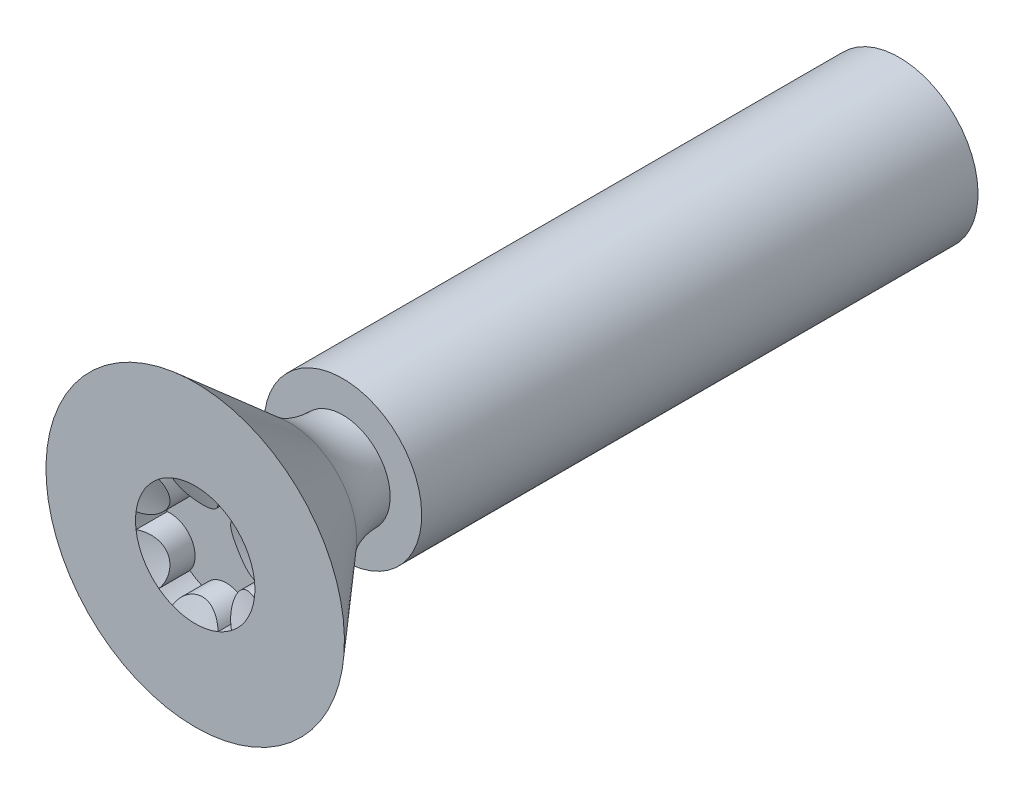
ISO-10303-21;
HEADER;
FILE_DESCRIPTION(('STEP AP214'),'2;1');
FILE_NAME('part.step','',(''),(''),'','','');
FILE_SCHEMA(('AUTOMOTIVE_DESIGN { 1 0 10303 214 1 1 1 1 }'));
ENDSEC;
DATA;
#1=APPLICATION_CONTEXT('core data for automotive mechanical design processes');
#2=APPLICATION_PROTOCOL_DEFINITION('international standard','automotive_design',2000,#1);
#3=PRODUCT_CONTEXT('',#1,'mechanical');
#4=PRODUCT('Part','Part','',(#3));
#5=PRODUCT_RELATED_PRODUCT_CATEGORY('part','',(#4));
#6=PRODUCT_DEFINITION_FORMATION('','',#4);
#7=PRODUCT_DEFINITION_CONTEXT('part definition',#1,'design');
#8=PRODUCT_DEFINITION('design','',#6,#7);
#9=PRODUCT_DEFINITION_SHAPE('','',#8);
#10=(LENGTH_UNIT() NAMED_UNIT(*) SI_UNIT(.MILLI.,.METRE.));
#11=(NAMED_UNIT(*) PLANE_ANGLE_UNIT() SI_UNIT($,.RADIAN.));
#12=(NAMED_UNIT(*) SI_UNIT($,.STERADIAN.) SOLID_ANGLE_UNIT());
#13=UNCERTAINTY_MEASURE_WITH_UNIT(LENGTH_MEASURE(1.E-05),#10,'distance_accuracy_value','');
#14=(GEOMETRIC_REPRESENTATION_CONTEXT(3) GLOBAL_UNCERTAINTY_ASSIGNED_CONTEXT((#13)) GLOBAL_UNIT_ASSIGNED_CONTEXT((#10,
#11,#12)) REPRESENTATION_CONTEXT('',''));
#15=CARTESIAN_POINT('',(0.,0.,0.));
#16=DIRECTION('',(0.,0.,1.));
#17=DIRECTION('',(1.,0.,0.));
#18=AXIS2_PLACEMENT_3D('',#15,#16,#17);
#19=CARTESIAN_POINT('',(0.,0.,-6.35));
#20=DIRECTION('',(0.,0.,1.));
#21=DIRECTION('',(0.,-1.,0.));
#22=AXIS2_PLACEMENT_3D('',#19,#20,#21);
#23=PLANE('',#22);
#24=CARTESIAN_POINT('',(0.,0.,-6.35));
#25=DIRECTION('',(0.,0.,1.));
#26=DIRECTION('',(0.,-1.,0.));
#27=AXIS2_PLACEMENT_3D('',#24,#25,#26);
#28=CIRCLE('',#27,1.4224);
#29=CARTESIAN_POINT('',(0.,-1.4224,-6.35));
#30=VERTEX_POINT('',#29);
#31=EDGE_CURVE('E51',#30,#30,#28,.T.);
#32=ORIENTED_EDGE('',*,*,#31,.F.);
#33=EDGE_LOOP('',(#32));
#34=FACE_BOUND('',#33,.T.);
#35=ADVANCED_FACE('F37',(#34),#23,.F.);
#36=CARTESIAN_POINT('',(0.,0.,6.35));
#37=DIRECTION('',(0.,0.,1.));
#38=DIRECTION('',(0.,-1.,0.));
#39=AXIS2_PLACEMENT_3D('',#36,#37,#38);
#40=CYLINDRICAL_SURFACE('',#39,1.4224);
#41=CARTESIAN_POINT('',(0.,0.,3.68638516960932));
#42=DIRECTION('',(0.,0.,1.));
#43=DIRECTION('',(0.,-1.,0.));
#44=AXIS2_PLACEMENT_3D('',#41,#42,#43);
#45=CIRCLE('',#44,1.4224);
#46=CARTESIAN_POINT('',(0.,-1.4224,3.68638516960932));
#47=VERTEX_POINT('',#46);
#48=EDGE_CURVE('E199',#47,#47,#45,.T.);
#49=ORIENTED_EDGE('',*,*,#48,.F.);
#50=EDGE_LOOP('',(#49));
#51=FACE_BOUND('',#50,.T.);
#52=ORIENTED_EDGE('',*,*,#31,.T.);
#53=EDGE_LOOP('',(#52));
#54=FACE_BOUND('',#53,.T.);
#55=ADVANCED_FACE('F204',(#51,#54),#40,.T.);
#56=CARTESIAN_POINT('',(0.,1.4224,3.68638516960932));
#57=DIRECTION('',(0.,0.,-1.));
#58=DIRECTION('',(0.,1.,0.));
#59=AXIS2_PLACEMENT_3D('',#56,#57,#58);
#60=PLANE('',#59);
#61=CARTESIAN_POINT('',(0.,0.,3.68638516960932));
#62=DIRECTION('',(0.,0.,1.));
#63=DIRECTION('',(0.,-1.,0.));
#64=AXIS2_PLACEMENT_3D('',#61,#62,#63);
#65=CIRCLE('',#64,0.853440000000003);
#66=CARTESIAN_POINT('',(0.,-0.853440000000004,3.68638516960932));
#67=VERTEX_POINT('',#66);
#68=EDGE_CURVE('E196',#67,#67,#65,.T.);
#69=ORIENTED_EDGE('',*,*,#68,.F.);
#70=EDGE_LOOP('',(#69));
#71=FACE_BOUND('',#70,.T.);
#72=ORIENTED_EDGE('',*,*,#48,.T.);
#73=EDGE_LOOP('',(#72));
#74=FACE_BOUND('',#73,.T.);
#75=ADVANCED_FACE('F210',(#71,#74),#60,.F.);
#76=CARTESIAN_POINT('',(0.,0.,3.68638516960932));
#77=DIRECTION('',(0.,0.,1.));
#78=DIRECTION('',(0.,-1.,0.));
#79=AXIS2_PLACEMENT_3D('',#76,#77,#78);
#80=TOROIDAL_SURFACE('',#79,2.31948922406243,1.46604922406243);
#81=CARTESIAN_POINT('',(0.,0.,4.6482));
#82=DIRECTION('',(0.,0.,1.));
#83=DIRECTION('',(0.,-1.,0.));
#84=AXIS2_PLACEMENT_3D('',#81,#82,#83);
#85=CIRCLE('',#84,1.21304782958435);
#86=CARTESIAN_POINT('',(0.,-1.21304782958435,4.6482));
#87=VERTEX_POINT('',#86);
#88=EDGE_CURVE('E193',#87,#87,#85,.T.);
#89=ORIENTED_EDGE('',*,*,#88,.F.);
#90=EDGE_LOOP('',(#89));
#91=FACE_BOUND('',#90,.T.);
#92=ORIENTED_EDGE('',*,*,#68,.T.);
#93=EDGE_LOOP('',(#92));
#94=FACE_BOUND('',#93,.T.);
#95=ADVANCED_FACE('F215',(#91,#94),#80,.F.);
#96=CARTESIAN_POINT('',(0.,0.,4.6482));
#97=DIRECTION('',(0.,0.,1.));
#98=DIRECTION('',(0.,-1.,0.));
#99=AXIS2_PLACEMENT_3D('',#96,#97,#98);
#100=CONICAL_SURFACE('',#99,1.21304782958435,0.715584993317673);
#101=CARTESIAN_POINT('',(0.,0.,6.35));
#102=DIRECTION('',(0.,0.,1.));
#103=DIRECTION('',(0.,-1.,0.));
#104=AXIS2_PLACEMENT_3D('',#101,#102,#103);
#105=CIRCLE('',#104,2.6924);
#106=CARTESIAN_POINT('',(0.,-2.6924,6.35));
#107=VERTEX_POINT('',#106);
#108=EDGE_CURVE('E188',#107,#107,#105,.T.);
#109=ORIENTED_EDGE('',*,*,#108,.F.);
#110=EDGE_LOOP('',(#109));
#111=FACE_BOUND('',#110,.T.);
#112=ORIENTED_EDGE('',*,*,#88,.T.);
#113=EDGE_LOOP('',(#112));
#114=FACE_BOUND('',#113,.T.);
#115=ADVANCED_FACE('F222',(#111,#114),#100,.T.);
#116=CARTESIAN_POINT('',(0.,2.6924,6.35));
#117=DIRECTION('',(0.,0.,-1.));
#118=DIRECTION('',(0.,1.,0.));
#119=AXIS2_PLACEMENT_3D('',#116,#117,#118);
#120=PLANE('',#119);
#121=CARTESIAN_POINT('',(0.,0.,6.35));
#122=DIRECTION('',(0.,0.,1.));
#123=DIRECTION('',(1.,0.,0.));
#124=AXIS2_PLACEMENT_3D('',#121,#122,#123);
#125=CIRCLE('',#124,1.07696);
#126=CARTESIAN_POINT('',(0.655611708585233,0.854409813360048,6.35));
#127=VERTEX_POINT('',#126);
#128=CARTESIAN_POINT('',(0.412134749319907,0.994981301333356,6.35));
#129=VERTEX_POINT('',#128);
#130=EDGE_CURVE('E147',#127,#129,#125,.T.);
#131=ORIENTED_EDGE('',*,*,#130,.F.);
#132=CARTESIAN_POINT('',(0.,0.,6.35));
#133=DIRECTION('',(0.,0.,1.));
#134=DIRECTION('',(1.,0.,0.));
#135=AXIS2_PLACEMENT_3D('',#132,#133,#134);
#136=CIRCLE('',#135,1.07696);
#137=CARTESIAN_POINT('',(1.06774645790514,0.140571487973304,6.35));
#138=VERTEX_POINT('',#137);
#139=EDGE_CURVE('E130',#138,#127,#136,.T.);
#140=ORIENTED_EDGE('',*,*,#139,.F.);
#141=CARTESIAN_POINT('',(0.,0.,6.35));
#142=DIRECTION('',(0.,0.,1.));
#143=DIRECTION('',(0.499999999999998,-0.86602540378444,0.));
#144=AXIS2_PLACEMENT_3D('',#141,#142,#143);
#145=CIRCLE('',#144,1.07696);
#146=CARTESIAN_POINT('',(1.06774645790514,-0.140571487973311,6.35));
#147=VERTEX_POINT('',#146);
#148=EDGE_CURVE('E144',#147,#138,#145,.T.);
#149=ORIENTED_EDGE('',*,*,#148,.F.);
#150=CARTESIAN_POINT('',(0.655611708585228,-0.854409813360052,6.35));
#151=VERTEX_POINT('',#150);
#152=EDGE_CURVE('E152',#151,#147,#136,.T.);
#153=ORIENTED_EDGE('',*,*,#152,.F.);
#154=CARTESIAN_POINT('',(0.,0.,6.35));
#155=DIRECTION('',(0.,0.,1.));
#156=DIRECTION('',(-0.500000000000004,-0.866025403784436,0.));
#157=AXIS2_PLACEMENT_3D('',#154,#155,#156);
#158=CIRCLE('',#157,1.07696);
#159=CARTESIAN_POINT('',(0.412134749319908,-0.994981301333355,6.35));
#160=VERTEX_POINT('',#159);
#161=EDGE_CURVE('E314',#160,#151,#158,.T.);
#162=ORIENTED_EDGE('',*,*,#161,.F.);
#163=CARTESIAN_POINT('',(-0.412134749319907,-0.994981301333356,6.35));
#164=VERTEX_POINT('',#163);
#165=EDGE_CURVE('E315',#164,#160,#136,.T.);
#166=ORIENTED_EDGE('',*,*,#165,.F.);
#167=CARTESIAN_POINT('',(0.,0.,6.35));
#168=DIRECTION('',(0.,0.,1.));
#169=DIRECTION('',(-1.,0.,0.));
#170=AXIS2_PLACEMENT_3D('',#167,#168,#169);
#171=CIRCLE('',#170,1.07696);
#172=CARTESIAN_POINT('',(-0.655611708585239,-0.854409813360043,6.35));
#173=VERTEX_POINT('',#172);
#174=EDGE_CURVE('E349',#173,#164,#171,.T.);
#175=ORIENTED_EDGE('',*,*,#174,.F.);
#176=CARTESIAN_POINT('',(-1.06774645790514,-0.140571487973297,6.35));
#177=VERTEX_POINT('',#176);
#178=EDGE_CURVE('E316',#177,#173,#136,.T.);
#179=ORIENTED_EDGE('',*,*,#178,.F.);
#180=CARTESIAN_POINT('',(0.,0.,6.35));
#181=DIRECTION('',(0.,0.,1.));
#182=DIRECTION('',(-0.499999999999992,0.866025403784443,0.));
#183=AXIS2_PLACEMENT_3D('',#180,#181,#182);
#184=CIRCLE('',#183,1.07696);
#185=CARTESIAN_POINT('',(-1.06774645790514,0.140571487973318,6.35));
#186=VERTEX_POINT('',#185);
#187=EDGE_CURVE('E332',#186,#177,#184,.T.);
#188=ORIENTED_EDGE('',*,*,#187,.F.);
#189=CARTESIAN_POINT('',(-0.655611708585222,0.854409813360056,6.35));
#190=VERTEX_POINT('',#189);
#191=EDGE_CURVE('E319',#190,#186,#136,.T.);
#192=ORIENTED_EDGE('',*,*,#191,.F.);
#193=CARTESIAN_POINT('',(0.,0.,6.35));
#194=DIRECTION('',(0.,0.,1.));
#195=DIRECTION('',(1.,0.,0.));
#196=AXIS2_PLACEMENT_3D('',#193,#194,#195);
#197=CIRCLE('',#196,1.07696);
#198=CARTESIAN_POINT('',(-0.412134749319908,0.994981301333355,6.35));
#199=VERTEX_POINT('',#198);
#200=EDGE_CURVE('E178',#199,#190,#197,.T.);
#201=ORIENTED_EDGE('',*,*,#200,.F.);
#202=EDGE_CURVE('E150',#129,#199,#136,.T.);
#203=ORIENTED_EDGE('',*,*,#202,.F.);
#204=EDGE_LOOP('',(#131,#140,#149,#153,#162,#166,#175,#179,#188,#192,#201,#203));
#205=FACE_BOUND('',#204,.T.);
#206=ORIENTED_EDGE('',*,*,#108,.T.);
#207=EDGE_LOOP('',(#206));
#208=FACE_BOUND('',#207,.T.);
#209=ADVANCED_FACE('F140',(#205,#208),#120,.F.);
#210=CARTESIAN_POINT('',(0.,0.,5.788406));
#211=DIRECTION('',(0.,0.,1.));
#212=DIRECTION('',(1.,0.,0.));
#213=AXIS2_PLACEMENT_3D('',#210,#211,#212);
#214=CYLINDRICAL_SURFACE('',#213,1.07696);
#215=ORIENTED_EDGE('',*,*,#200,.T.);
#216=DIRECTION('',(0.,0.,1.));
#217=VECTOR('',#216,1.);
#218=CARTESIAN_POINT('',(-0.655611708585222,0.854409813360056,5.788406));
#219=LINE('',#218,#217);
#220=CARTESIAN_POINT('',(-0.655611708585222,0.854409813360056,5.788406));
#221=VERTEX_POINT('',#220);
#222=EDGE_CURVE('E343',#221,#190,#219,.T.);
#223=ORIENTED_EDGE('',*,*,#222,.F.);
#224=CARTESIAN_POINT('',(0.,0.,5.788406));
#225=DIRECTION('',(0.,0.,1.));
#226=DIRECTION('',(1.,0.,0.));
#227=AXIS2_PLACEMENT_3D('',#224,#225,#226);
#228=CIRCLE('',#227,1.07696);
#229=CARTESIAN_POINT('',(-0.412134749319908,0.994981301333355,5.788406));
#230=VERTEX_POINT('',#229);
#231=EDGE_CURVE('E181',#230,#221,#228,.T.);
#232=ORIENTED_EDGE('',*,*,#231,.F.);
#233=DIRECTION('',(0.,0.,1.));
#234=VECTOR('',#233,1.);
#235=CARTESIAN_POINT('',(-0.412134749319908,0.994981301333355,5.788406));
#236=LINE('',#235,#234);
#237=EDGE_CURVE('E58',#230,#199,#236,.T.);
#238=ORIENTED_EDGE('',*,*,#237,.T.);
#239=EDGE_LOOP('',(#215,#223,#232,#238));
#240=FACE_BOUND('',#239,.T.);
#241=ADVANCED_FACE('F229',(#240),#214,.F.);
#242=CARTESIAN_POINT('',(0.,1.1656931040269,5.788406));
#243=DIRECTION('',(0.,0.,1.));
#244=DIRECTION('',(1.,0.,0.));
#245=AXIS2_PLACEMENT_3D('',#242,#243,#244);
#246=CYLINDRICAL_SURFACE('',#245,0.446091438133329);
#247=DIRECTION('',(0.,0.,1.));
#248=VECTOR('',#247,1.);
#249=CARTESIAN_POINT('',(0.412134749319907,0.994981301333355,5.788406));
#250=LINE('',#249,#248);
#251=CARTESIAN_POINT('',(0.412134749319907,0.994981301333355,5.788406));
#252=VERTEX_POINT('',#251);
#253=EDGE_CURVE('E183',#252,#129,#250,.T.);
#254=ORIENTED_EDGE('',*,*,#253,.T.);
#255=CARTESIAN_POINT('',(0.412217535189932,0.995181301333363,6.35007878379122));
#256=CARTESIAN_POINT('',(0.402218532584292,0.970978856009884,6.34056377677122));
#257=CARTESIAN_POINT('',(0.390069787174501,0.947669824303697,6.33101891366794));
#258=CARTESIAN_POINT('',(0.361780712977006,0.903392429802186,6.31220411475033));
#259=CARTESIAN_POINT('',(0.345629774957911,0.882430506814702,6.30293498421686));
#260=CARTESIAN_POINT('',(0.309679984041634,0.843514203319636,6.28505045217848));
#261=CARTESIAN_POINT('',(0.289876786592517,0.82556345383982,6.27643584668143));
#262=CARTESIAN_POINT('',(0.247080771537108,0.793315302332872,6.26039120388156));
#263=CARTESIAN_POINT('',(0.224090675265836,0.779014812594221,6.25296016742611));
#264=CARTESIAN_POINT('',(0.176713064753171,0.755283841482144,6.24025566684374));
#265=CARTESIAN_POINT('',(0.152456468355724,0.745642319957259,6.23489154992137));
#266=CARTESIAN_POINT('',(0.102273448420043,0.730698298567651,6.22642957349096));
#267=CARTESIAN_POINT('',(0.0763492624458178,0.725390110068896,6.22332874339494));
#268=CARTESIAN_POINT('',(0.0270471068895947,0.719818940453361,6.22006478463054));
#269=CARTESIAN_POINT('',(0.00375046947984284,0.71901346298047,6.2195859263302));
#270=CARTESIAN_POINT('',(-0.0426261801452408,0.721037250446202,6.22077785922149));
#271=CARTESIAN_POINT('',(-0.0657062300058927,0.723865871493425,6.22244826960471));
#272=CARTESIAN_POINT('',(-0.109487556319788,0.732706386386486,6.22755874354336));
#273=CARTESIAN_POINT('',(-0.130246890731964,0.738505190424075,6.23087995243548));
#274=CARTESIAN_POINT('',(-0.170477358946198,0.752907678496629,6.23891229574263));
#275=CARTESIAN_POINT('',(-0.189948239915114,0.761511911088823,6.24362370197164));
#276=CARTESIAN_POINT('',(-0.228759760915408,0.782043850090003,6.25452461342052));
#277=CARTESIAN_POINT('',(-0.247962722776532,0.794183940675942,6.26080279790926));
#278=CARTESIAN_POINT('',(-0.284136023529871,0.821058978826113,6.27421274588709));
#279=CARTESIAN_POINT('',(-0.301104417812656,0.835796160747644,6.28134524266095));
#280=CARTESIAN_POINT('',(-0.334388855623221,0.869374807430502,6.29702366364388));
#281=CARTESIAN_POINT('',(-0.350391677575767,0.88849537385316,6.30563706078043));
#282=CARTESIAN_POINT('',(-0.378924549806628,0.928995777520554,6.32318513890219));
#283=CARTESIAN_POINT('',(-0.391460272419411,0.950371844535248,6.33211926776797));
#284=CARTESIAN_POINT('',(-0.405706120214104,0.980035972287522,6.34407927085055));
#285=CARTESIAN_POINT('',(-0.409068533600499,0.98756633153689,6.34708004824173));
#286=CARTESIAN_POINT('',(-0.412217535189934,0.995181301333363,6.35007878379122));
#287=B_SPLINE_CURVE_WITH_KNOTS('',3,(#255,#256,#257,#258,#259,#260,#261,#262,#263,#264,#265,
#266,#267,#268,#269,#270,#271,#272,#273,#274,#275,#276,#277,#278,#279,#280,#281,#282,#283,#284,
#285,#286),.UNSPECIFIED.,.F.,.F.,(4,2,2,2,2,2,2,2,2,2,2,2,2,2,2,4),(0.,0.0835011768916914,
0.167226116630064,0.251051301543926,0.33480534297495,0.414291234869104,0.493672612159344,
0.563242414916322,0.632799892960467,0.697949380928841,0.763111615497498,0.8335396810455,
0.904028636484711,0.982834929381849,1.06151151843471,1.08782618491492),.UNSPECIFIED.);
#288=EDGE_CURVE('E135',#129,#199,#287,.T.);
#289=ORIENTED_EDGE('',*,*,#288,.T.);
#290=ORIENTED_EDGE('',*,*,#237,.F.);
#291=CARTESIAN_POINT('',(0.,1.1656931040269,5.788406));
#292=DIRECTION('',(0.,0.,-1.));
#293=DIRECTION('',(1.,0.,0.));
#294=AXIS2_PLACEMENT_3D('',#291,#292,#293);
#295=CIRCLE('',#294,0.446091438133329);
#296=EDGE_CURVE('E177',#252,#230,#295,.T.);
#297=ORIENTED_EDGE('',*,*,#296,.F.);
#298=EDGE_LOOP('',(#254,#289,#290,#297));
#299=FACE_BOUND('',#298,.T.);
#300=ADVANCED_FACE('F234',(#299),#246,.T.);
#301=CARTESIAN_POINT('',(0.,0.,5.788406));
#302=DIRECTION('',(0.,0.,1.));
#303=DIRECTION('',(1.,0.,0.));
#304=AXIS2_PLACEMENT_3D('',#301,#302,#303);
#305=CYLINDRICAL_SURFACE('',#304,1.07696);
#306=ORIENTED_EDGE('',*,*,#130,.T.);
#307=ORIENTED_EDGE('',*,*,#253,.F.);
#308=CARTESIAN_POINT('',(0.,0.,5.788406));
#309=DIRECTION('',(0.,0.,1.));
#310=DIRECTION('',(1.,0.,0.));
#311=AXIS2_PLACEMENT_3D('',#308,#309,#310);
#312=CIRCLE('',#311,1.07696);
#313=CARTESIAN_POINT('',(0.655611708585233,0.854409813360048,5.788406));
#314=VERTEX_POINT('',#313);
#315=EDGE_CURVE('E174',#314,#252,#312,.T.);
#316=ORIENTED_EDGE('',*,*,#315,.F.);
#317=DIRECTION('',(0.,0.,1.));
#318=VECTOR('',#317,1.);
#319=CARTESIAN_POINT('',(0.655611708585233,0.854409813360048,5.788406));
#320=LINE('',#319,#318);
#321=EDGE_CURVE('E160',#314,#127,#320,.T.);
#322=ORIENTED_EDGE('',*,*,#321,.T.);
#323=EDGE_LOOP('',(#306,#307,#316,#322));
#324=FACE_BOUND('',#323,.T.);
#325=ADVANCED_FACE('F230',(#324),#305,.F.);
#326=CARTESIAN_POINT('',(0.,0.,5.788406));
#327=DIRECTION('',(0.,0.,1.));
#328=DIRECTION('',(1.,0.,0.));
#329=AXIS2_PLACEMENT_3D('',#326,#327,#328);
#330=PLANE('',#329);
#331=CARTESIAN_POINT('',(1.00951984110363,0.582846552013447,5.788406));
#332=DIRECTION('',(0.,0.,-1.));
#333=DIRECTION('',(0.499999999999998,-0.86602540378444,0.));
#334=AXIS2_PLACEMENT_3D('',#331,#332,#333);
#335=CIRCLE('',#334,0.446091438133329);
#336=CARTESIAN_POINT('',(1.06774645790514,0.140571487973304,5.788406));
#337=VERTEX_POINT('',#336);
#338=EDGE_CURVE('E157',#337,#314,#335,.T.);
#339=ORIENTED_EDGE('',*,*,#338,.T.);
#340=ORIENTED_EDGE('',*,*,#315,.T.);
#341=ORIENTED_EDGE('',*,*,#296,.T.);
#342=ORIENTED_EDGE('',*,*,#231,.T.);
#343=CARTESIAN_POINT('',(-1.00951984110362,0.58284655201346,5.788406));
#344=DIRECTION('',(0.,0.,-1.));
#345=DIRECTION('',(0.50000000000001,0.866025403784433,0.));
#346=AXIS2_PLACEMENT_3D('',#343,#344,#345);
#347=CIRCLE('',#346,0.446091438133329);
#348=CARTESIAN_POINT('',(-1.06774645790514,0.140571487973318,5.788406));
#349=VERTEX_POINT('',#348);
#350=EDGE_CURVE('E246',#221,#349,#347,.T.);
#351=ORIENTED_EDGE('',*,*,#350,.T.);
#352=CARTESIAN_POINT('',(0.,0.,5.788406));
#353=DIRECTION('',(0.,0.,1.));
#354=DIRECTION('',(-0.499999999999992,0.866025403784443,0.));
#355=AXIS2_PLACEMENT_3D('',#352,#353,#354);
#356=CIRCLE('',#355,1.07696);
#357=CARTESIAN_POINT('',(-1.06774645790514,-0.140571487973297,5.788406));
#358=VERTEX_POINT('',#357);
#359=EDGE_CURVE('E337',#349,#358,#356,.T.);
#360=ORIENTED_EDGE('',*,*,#359,.T.);
#361=CARTESIAN_POINT('',(-1.00951984110363,-0.58284655201344,5.788406));
#362=DIRECTION('',(0.,0.,-1.));
#363=DIRECTION('',(-0.499999999999992,0.866025403784443,0.));
#364=AXIS2_PLACEMENT_3D('',#361,#362,#363);
#365=CIRCLE('',#364,0.446091438133329);
#366=CARTESIAN_POINT('',(-0.655611708585239,-0.854409813360043,5.788406));
#367=VERTEX_POINT('',#366);
#368=EDGE_CURVE('E341',#358,#367,#365,.T.);
#369=ORIENTED_EDGE('',*,*,#368,.T.);
#370=CARTESIAN_POINT('',(0.,0.,5.788406));
#371=DIRECTION('',(0.,0.,1.));
#372=DIRECTION('',(-1.,0.,0.));
#373=AXIS2_PLACEMENT_3D('',#370,#371,#372);
#374=CIRCLE('',#373,1.07696);
#375=CARTESIAN_POINT('',(-0.412134749319907,-0.994981301333355,5.788406));
#376=VERTEX_POINT('',#375);
#377=EDGE_CURVE('E352',#367,#376,#374,.T.);
#378=ORIENTED_EDGE('',*,*,#377,.T.);
#379=CARTESIAN_POINT('',(0.,-1.1656931040269,5.788406));
#380=DIRECTION('',(0.,0.,-1.));
#381=DIRECTION('',(-1.,0.,0.));
#382=AXIS2_PLACEMENT_3D('',#379,#380,#381);
#383=CIRCLE('',#382,0.446091438133329);
#384=CARTESIAN_POINT('',(0.412134749319908,-0.994981301333355,5.788406));
#385=VERTEX_POINT('',#384);
#386=EDGE_CURVE('E355',#376,#385,#383,.T.);
#387=ORIENTED_EDGE('',*,*,#386,.T.);
#388=CARTESIAN_POINT('',(0.,0.,5.788406));
#389=DIRECTION('',(0.,0.,1.));
#390=DIRECTION('',(-0.500000000000004,-0.866025403784436,0.));
#391=AXIS2_PLACEMENT_3D('',#388,#389,#390);
#392=CIRCLE('',#391,1.07696);
#393=CARTESIAN_POINT('',(0.655611708585228,-0.854409813360052,5.788406));
#394=VERTEX_POINT('',#393);
#395=EDGE_CURVE('E366',#385,#394,#392,.T.);
#396=ORIENTED_EDGE('',*,*,#395,.T.);
#397=CARTESIAN_POINT('',(1.00951984110363,-0.582846552013453,5.788406));
#398=DIRECTION('',(0.,0.,-1.));
#399=DIRECTION('',(-0.500000000000004,-0.866025403784436,0.));
#400=AXIS2_PLACEMENT_3D('',#397,#398,#399);
#401=CIRCLE('',#400,0.446091438133329);
#402=CARTESIAN_POINT('',(1.06774645790514,-0.140571487973311,5.788406));
#403=VERTEX_POINT('',#402);
#404=EDGE_CURVE('E307',#394,#403,#401,.T.);
#405=ORIENTED_EDGE('',*,*,#404,.T.);
#406=CARTESIAN_POINT('',(0.,0.,5.788406));
#407=DIRECTION('',(0.,0.,1.));
#408=DIRECTION('',(0.499999999999998,-0.86602540378444,0.));
#409=AXIS2_PLACEMENT_3D('',#406,#407,#408);
#410=CIRCLE('',#409,1.07696);
#411=EDGE_CURVE('E166',#403,#337,#410,.T.);
#412=ORIENTED_EDGE('',*,*,#411,.T.);
#413=EDGE_LOOP('',(#339,#340,#341,#342,#351,#360,#369,#378,#387,#396,#405,#412));
#414=FACE_BOUND('',#413,.T.);
#415=ADVANCED_FACE('F233',(#414),#330,.T.);
#416=CARTESIAN_POINT('',(1.00951984110363,0.582846552013447,5.788406));
#417=DIRECTION('',(0.,0.,1.));
#418=DIRECTION('',(1.,0.,0.));
#419=AXIS2_PLACEMENT_3D('',#416,#417,#418);
#420=CYLINDRICAL_SURFACE('',#419,0.446091438133329);
#421=DIRECTION('',(0.,0.,1.));
#422=VECTOR('',#421,1.);
#423=CARTESIAN_POINT('',(1.06774645790514,0.140571487973304,5.788406));
#424=LINE('',#423,#422);
#425=EDGE_CURVE('E154',#337,#138,#424,.T.);
#426=ORIENTED_EDGE('',*,*,#425,.T.);
#427=CARTESIAN_POINT('',(1.06794645790514,0.140597864480073,6.35007342436951));
#428=CARTESIAN_POINT('',(1.0419870198108,0.137156903808665,6.34055845784469));
#429=CARTESIAN_POINT('',(1.01572649723712,0.136024370427879,6.33101365798389));
#430=CARTESIAN_POINT('',(0.963236856382313,0.138386419626026,6.31219904050315));
#431=CARTESIAN_POINT('',(0.937008010910264,0.141893411870822,6.30293002845079));
#432=CARTESIAN_POINT('',(0.885331089012054,0.153570315168539,6.2850458053512));
#433=CARTESIAN_POINT('',(0.859883985138948,0.161745804871025,6.2764313904983));
#434=CARTESIAN_POINT('',(0.810558986388017,0.182685695571367,6.26038722372097));
#435=CARTESIAN_POINT('',(0.786679777731734,0.195446195105916,6.25295647233255));
#436=CARTESIAN_POINT('',(0.742440426279593,0.22461220479501,6.24025266671022));
#437=CARTESIAN_POINT('',(0.721962958089376,0.240798798794242,6.23488894526767));
#438=CARTESIAN_POINT('',(0.683930895704958,0.276787459278119,6.22642781850148));
#439=CARTESIAN_POINT('',(0.666372493733786,0.296584743926222,6.22332744255509));
#440=CARTESIAN_POINT('',(0.636898066295452,0.33649656190161,6.22006433751378));
#441=CARTESIAN_POINT('',(0.624552878991043,0.356269428534179,6.21958587440746));
#442=CARTESIAN_POINT('',(0.603118577567221,0.397444772762326,6.22077853322926));
#443=CARTESIAN_POINT('',(0.594028887374358,0.418846961229223,6.22244927460643));
#444=CARTESIAN_POINT('',(0.579795498616561,0.461183032826544,6.22756032802164));
#445=CARTESIAN_POINT('',(0.574438272675969,0.482060669070351,6.23088181302144));
#446=CARTESIAN_POINT('',(0.566797021813467,0.52410268317885,6.23891465381128));
#447=CARTESIAN_POINT('',(0.564513598463478,0.54526711635398,6.24362628144533));
#448=CARTESIAN_POINT('',(0.562890111667022,0.589145052048377,6.25452764540709));
#449=CARTESIAN_POINT('',(0.56380284668153,0.611845506362739,6.26080606696333));
#450=CARTESIAN_POINT('',(0.568991878426509,0.656610244451042,6.27421644490775));
#451=CARTESIAN_POINT('',(0.573271082083871,0.67867396132832,6.2813491344369));
#452=CARTESIAN_POINT('',(0.585710169356141,0.724288446915928,6.29702790521994));
#453=CARTESIAN_POINT('',(0.594268368370634,0.74770750002312,6.30564145312157));
#454=CARTESIAN_POINT('',(0.615077746169878,0.792667622895215,6.32318978825504));
#455=CARTESIAN_POINT('',(0.627322825665854,0.814211719140461,6.33212402362899));
#456=CARTESIAN_POINT('',(0.645894926147466,0.841386822500592,6.34408683379995));
#457=CARTESIAN_POINT('',(0.650739946248591,0.84806971006797,6.3470903299764));
#458=CARTESIAN_POINT('',(0.655765263796742,0.854609813346334,6.35009177478416));
#459=B_SPLINE_CURVE_WITH_KNOTS('',3,(#427,#428,#429,#430,#431,#432,#433,#434,#435,#436,#437,
#438,#439,#440,#441,#442,#443,#444,#445,#446,#447,#448,#449,#450,#451,#452,#453,#454,#455,#456,
#457,#458),.UNSPECIFIED.,.F.,.F.,(4,2,2,2,2,2,2,2,2,2,2,2,2,2,2,4),(0.,0.0835008294128591,
0.167225456561838,0.25105034095401,0.334804065582383,0.414289219499643,0.493669861304818,
0.563238866404968,0.632795554897446,0.697945136265738,0.763107466163767,0.833536236880948,
0.904025889288688,0.982832800048652,1.06151004848508,1.0878484953377),.UNSPECIFIED.);
#460=EDGE_CURVE('E127',#138,#127,#459,.T.);
#461=ORIENTED_EDGE('',*,*,#460,.T.);
#462=ORIENTED_EDGE('',*,*,#321,.F.);
#463=ORIENTED_EDGE('',*,*,#338,.F.);
#464=EDGE_LOOP('',(#426,#461,#462,#463));
#465=FACE_BOUND('',#464,.T.);
#466=ADVANCED_FACE('F155',(#465),#420,.T.);
#467=CARTESIAN_POINT('',(0.,0.,5.788406));
#468=DIRECTION('',(0.,0.,1.));
#469=DIRECTION('',(1.,0.,0.));
#470=AXIS2_PLACEMENT_3D('',#467,#468,#469);
#471=CYLINDRICAL_SURFACE('',#470,1.07696);
#472=ORIENTED_EDGE('',*,*,#148,.T.);
#473=ORIENTED_EDGE('',*,*,#425,.F.);
#474=ORIENTED_EDGE('',*,*,#411,.F.);
#475=DIRECTION('',(0.,0.,1.));
#476=VECTOR('',#475,1.);
#477=CARTESIAN_POINT('',(1.06774645790514,-0.140571487973311,5.788406));
#478=LINE('',#477,#476);
#479=EDGE_CURVE('E165',#403,#147,#478,.T.);
#480=ORIENTED_EDGE('',*,*,#479,.T.);
#481=EDGE_LOOP('',(#472,#473,#474,#480));
#482=FACE_BOUND('',#481,.T.);
#483=ADVANCED_FACE('F163',(#482),#471,.F.);
#484=CARTESIAN_POINT('',(1.00951984110363,-0.582846552013453,5.788406));
#485=DIRECTION('',(0.,0.,1.));
#486=DIRECTION('',(0.,-1.,0.));
#487=AXIS2_PLACEMENT_3D('',#484,#485,#486);
#488=CYLINDRICAL_SURFACE('',#487,0.446091438133329);
#489=DIRECTION('',(0.,0.,1.));
#490=VECTOR('',#489,1.);
#491=CARTESIAN_POINT('',(0.655611708585228,-0.854409813360052,5.788406));
#492=LINE('',#491,#490);
#493=EDGE_CURVE('E169',#394,#151,#492,.T.);
#494=ORIENTED_EDGE('',*,*,#493,.T.);
#495=CARTESIAN_POINT('',(0.655765263796738,-0.854609813346337,6.35009177478416));
#496=CARTESIAN_POINT('',(0.639803007982871,-0.833850266104216,6.34057666966102));
#497=CARTESIAN_POINT('',(0.625689283916424,-0.811675537161665,6.33103165331887));
#498=CARTESIAN_POINT('',(0.601484629397532,-0.765039317347505,6.31221641474202));
#499=CARTESIAN_POINT('',(0.59140457613841,-0.740571860006172,6.30294699709301));
#500=CARTESIAN_POINT('',(0.575672974519262,-0.689981233539063,6.28506171635604));
#501=CARTESIAN_POINT('',(0.570026741326349,-0.663856117653794,6.27644664882444));
#502=CARTESIAN_POINT('',(0.563492936752706,-0.610669934076368,6.26040085232468));
#503=CARTESIAN_POINT('',(0.562601332975101,-0.583609679087525,6.2529691249587));
#504=CARTESIAN_POINT('',(0.565734519140334,-0.530713269943585,6.24026293996084));
#505=CARTESIAN_POINT('',(0.569511143641453,-0.504884990361241,6.23489786446445));
#506=CARTESIAN_POINT('',(0.581657223767206,-0.453951468562531,6.22643382851979));
#507=CARTESIAN_POINT('',(0.590020633629591,-0.428845320263515,6.22333189757464));
#508=CARTESIAN_POINT('',(0.609844194841513,-0.383360411384742,6.22006586931822));
#509=CARTESIAN_POINT('',(0.620793843309674,-0.362780885051094,6.21958605302833));
#510=CARTESIAN_POINT('',(0.645732959603927,-0.323626655496741,6.22077622619767));
#511=CARTESIAN_POINT('',(0.659721887652558,-0.305051597157215,6.22244583417717));
#512=CARTESIAN_POINT('',(0.689267095668949,-0.271553760329992,6.22755490322707));
#513=CARTESIAN_POINT('',(0.704667772945775,-0.2564740896021,6.23087544259833));
#514=CARTESIAN_POINT('',(0.737254298115405,-0.22883269202853,6.23890657980157));
#515=CARTESIAN_POINT('',(0.75444049475462,-0.216271458491276,6.24361744952391));
#516=CARTESIAN_POINT('',(0.791625690876353,-0.192923613188308,6.25451726576759));
#517=CARTESIAN_POINT('',(0.811739761940662,-0.182362356319587,6.26079487734863));
#518=CARTESIAN_POINT('',(0.853098938295507,-0.164470594855157,6.27420378306731));
#519=CARTESIAN_POINT('',(0.874345006227985,-0.157142890827585,6.28133581044139));
#520=CARTESIAN_POINT('',(0.920065544873897,-0.145104221284687,6.29701337547354));
#521=CARTESIAN_POINT('',(0.944625137478479,-0.140804060372995,6.3056264010885));
#522=CARTESIAN_POINT('',(0.993964766713689,-0.136340720815941,6.32317384897608));
#523=CARTESIAN_POINT('',(1.01874437416973,-0.136170747303826,6.33210771914511));
#524=CARTESIAN_POINT('',(1.05156276903623,-0.138663575964892,6.34406964269414));
#525=CARTESIAN_POINT('',(1.05977134889469,-0.139516995122653,6.34707255471823));
#526=CARTESIAN_POINT('',(1.06794645790514,-0.140597864480079,6.35007342436951));
#527=B_SPLINE_CURVE_WITH_KNOTS('',3,(#495,#496,#497,#498,#499,#500,#501,#502,#503,#504,#505,
#506,#507,#508,#509,#510,#511,#512,#513,#514,#515,#516,#517,#518,#519,#520,#521,#522,#523,#524,
#525,#526),.UNSPECIFIED.,.F.,.F.,(4,2,2,2,2,2,2,2,2,2,2,2,2,2,2,4),(0.,0.0835020190116961,
0.167227716185186,0.25105362933185,0.334808438478287,0.414296118903637,0.493679278923543,
0.563251016156545,0.632810407502417,0.697959665907994,0.763121673230443,0.833548045985626,
0.904035295614633,0.982840016506707,1.06151508132148,1.08784847899325),.UNSPECIFIED.);
#528=EDGE_CURVE('E136',#151,#147,#527,.T.);
#529=ORIENTED_EDGE('',*,*,#528,.T.);
#530=ORIENTED_EDGE('',*,*,#479,.F.);
#531=ORIENTED_EDGE('',*,*,#404,.F.);
#532=EDGE_LOOP('',(#494,#529,#530,#531));
#533=FACE_BOUND('',#532,.T.);
#534=ADVANCED_FACE('F285',(#533),#488,.T.);
#535=CARTESIAN_POINT('',(0.,0.,5.788406));
#536=DIRECTION('',(0.,0.,1.));
#537=DIRECTION('',(0.,-1.,0.));
#538=AXIS2_PLACEMENT_3D('',#535,#536,#537);
#539=CYLINDRICAL_SURFACE('',#538,1.07696);
#540=ORIENTED_EDGE('',*,*,#161,.T.);
#541=ORIENTED_EDGE('',*,*,#493,.F.);
#542=ORIENTED_EDGE('',*,*,#395,.F.);
#543=DIRECTION('',(0.,0.,1.));
#544=VECTOR('',#543,1.);
#545=CARTESIAN_POINT('',(0.412134749319908,-0.994981301333355,5.788406));
#546=LINE('',#545,#544);
#547=EDGE_CURVE('E361',#385,#160,#546,.T.);
#548=ORIENTED_EDGE('',*,*,#547,.T.);
#549=EDGE_LOOP('',(#540,#541,#542,#548));
#550=FACE_BOUND('',#549,.T.);
#551=ADVANCED_FACE('F290',(#550),#539,.F.);
#552=CARTESIAN_POINT('',(0.,-1.1656931040269,5.788406));
#553=DIRECTION('',(0.,0.,1.));
#554=DIRECTION('',(0.,-1.,0.));
#555=AXIS2_PLACEMENT_3D('',#552,#553,#554);
#556=CYLINDRICAL_SURFACE('',#555,0.446091438133329);
#557=DIRECTION('',(0.,0.,1.));
#558=VECTOR('',#557,1.);
#559=CARTESIAN_POINT('',(-0.412134749319907,-0.994981301333355,5.788406));
#560=LINE('',#559,#558);
#561=EDGE_CURVE('E358',#376,#164,#560,.T.);
#562=ORIENTED_EDGE('',*,*,#561,.T.);
#563=CARTESIAN_POINT('',(-0.412217535189932,-0.995181301333363,6.35007878379122));
#564=CARTESIAN_POINT('',(-0.402218532584292,-0.970978856009884,6.34056377677122));
#565=CARTESIAN_POINT('',(-0.390069787174501,-0.947669824303697,6.33101891366794));
#566=CARTESIAN_POINT('',(-0.361780712977006,-0.903392429802186,6.31220411475033));
#567=CARTESIAN_POINT('',(-0.345629774957911,-0.882430506814702,6.30293498421686));
#568=CARTESIAN_POINT('',(-0.309679984041634,-0.843514203319636,6.28505045217848));
#569=CARTESIAN_POINT('',(-0.289876786592517,-0.82556345383982,6.27643584668143));
#570=CARTESIAN_POINT('',(-0.247080771537108,-0.793315302332872,6.26039120388156));
#571=CARTESIAN_POINT('',(-0.224090675265836,-0.779014812594221,6.25296016742611));
#572=CARTESIAN_POINT('',(-0.176713064753171,-0.755283841482144,6.24025566684374));
#573=CARTESIAN_POINT('',(-0.152456468355724,-0.745642319957259,6.23489154992137));
#574=CARTESIAN_POINT('',(-0.102273448420043,-0.730698298567651,6.22642957349096));
#575=CARTESIAN_POINT('',(-0.0763492624458178,-0.725390110068896,6.22332874339494));
#576=CARTESIAN_POINT('',(-0.0270471068895947,-0.719818940453361,6.22006478463054));
#577=CARTESIAN_POINT('',(-0.00375046947984284,-0.71901346298047,6.2195859263302));
#578=CARTESIAN_POINT('',(0.0426261801452408,-0.721037250446202,6.22077785922149));
#579=CARTESIAN_POINT('',(0.0657062300058927,-0.723865871493425,6.22244826960471));
#580=CARTESIAN_POINT('',(0.109487556319788,-0.732706386386486,6.22755874354336));
#581=CARTESIAN_POINT('',(0.130246890731964,-0.738505190424075,6.23087995243548));
#582=CARTESIAN_POINT('',(0.170477358946198,-0.752907678496629,6.23891229574263));
#583=CARTESIAN_POINT('',(0.189948239915114,-0.761511911088823,6.24362370197164));
#584=CARTESIAN_POINT('',(0.228759760915408,-0.782043850090003,6.25452461342052));
#585=CARTESIAN_POINT('',(0.247962722776532,-0.794183940675942,6.26080279790926));
#586=CARTESIAN_POINT('',(0.284136023529871,-0.821058978826113,6.27421274588709));
#587=CARTESIAN_POINT('',(0.301104417812656,-0.835796160747644,6.28134524266095));
#588=CARTESIAN_POINT('',(0.334388855623221,-0.869374807430502,6.29702366364388));
#589=CARTESIAN_POINT('',(0.350391677575767,-0.88849537385316,6.30563706078043));
#590=CARTESIAN_POINT('',(0.378924549806628,-0.928995777520554,6.32318513890219));
#591=CARTESIAN_POINT('',(0.391460272419411,-0.950371844535248,6.33211926776797));
#592=CARTESIAN_POINT('',(0.405706120214104,-0.980035972287522,6.34407927085055));
#593=CARTESIAN_POINT('',(0.409068533600499,-0.98756633153689,6.34708004824173));
#594=CARTESIAN_POINT('',(0.412217535189934,-0.995181301333363,6.35007878379122));
#595=B_SPLINE_CURVE_WITH_KNOTS('',3,(#563,#564,#565,#566,#567,#568,#569,#570,#571,#572,#573,
#574,#575,#576,#577,#578,#579,#580,#581,#582,#583,#584,#585,#586,#587,#588,#589,#590,#591,#592,
#593,#594),.UNSPECIFIED.,.F.,.F.,(4,2,2,2,2,2,2,2,2,2,2,2,2,2,2,4),(0.,0.0835011768916914,
0.167226116630064,0.251051301543926,0.33480534297495,0.414291234869104,0.493672612159344,
0.563242414916322,0.632799892960467,0.697949380928841,0.763111615497498,0.8335396810455,
0.904028636484711,0.982834929381849,1.06151151843471,1.08782618491492),.UNSPECIFIED.);
#596=EDGE_CURVE('E273',#164,#160,#595,.T.);
#597=ORIENTED_EDGE('',*,*,#596,.T.);
#598=ORIENTED_EDGE('',*,*,#547,.F.);
#599=ORIENTED_EDGE('',*,*,#386,.F.);
#600=EDGE_LOOP('',(#562,#597,#598,#599));
#601=FACE_BOUND('',#600,.T.);
#602=ADVANCED_FACE('F294',(#601),#556,.T.);
#603=CARTESIAN_POINT('',(0.,0.,5.788406));
#604=DIRECTION('',(0.,0.,1.));
#605=DIRECTION('',(0.,-1.,0.));
#606=AXIS2_PLACEMENT_3D('',#603,#604,#605);
#607=CYLINDRICAL_SURFACE('',#606,1.07696);
#608=ORIENTED_EDGE('',*,*,#174,.T.);
#609=ORIENTED_EDGE('',*,*,#561,.F.);
#610=ORIENTED_EDGE('',*,*,#377,.F.);
#611=DIRECTION('',(0.,0.,1.));
#612=VECTOR('',#611,1.);
#613=CARTESIAN_POINT('',(-0.655611708585239,-0.854409813360043,5.788406));
#614=LINE('',#613,#612);
#615=EDGE_CURVE('E346',#367,#173,#614,.T.);
#616=ORIENTED_EDGE('',*,*,#615,.T.);
#617=EDGE_LOOP('',(#608,#609,#610,#616));
#618=FACE_BOUND('',#617,.T.);
#619=ADVANCED_FACE('F292',(#618),#607,.F.);
#620=CARTESIAN_POINT('',(-1.00951984110363,-0.58284655201344,5.788406));
#621=DIRECTION('',(0.,0.,1.));
#622=DIRECTION('',(0.,-1.,0.));
#623=AXIS2_PLACEMENT_3D('',#620,#621,#622);
#624=CYLINDRICAL_SURFACE('',#623,0.446091438133329);
#625=DIRECTION('',(0.,0.,1.));
#626=VECTOR('',#625,1.);
#627=CARTESIAN_POINT('',(-1.06774645790514,-0.140571487973297,5.788406));
#628=LINE('',#627,#626);
#629=EDGE_CURVE('E350',#358,#177,#628,.T.);
#630=ORIENTED_EDGE('',*,*,#629,.T.);
#631=CARTESIAN_POINT('',(-1.06794645790514,-0.140597864480066,6.35007342436951));
#632=CARTESIAN_POINT('',(-1.0419870198108,-0.137156903808658,6.34055845784469));
#633=CARTESIAN_POINT('',(-1.01572649723712,-0.136024370427871,6.33101365798389));
#634=CARTESIAN_POINT('',(-0.963236856382314,-0.138386419626019,6.31219904050315));
#635=CARTESIAN_POINT('',(-0.937008010910265,-0.141893411870816,6.30293002845079));
#636=CARTESIAN_POINT('',(-0.885331089012055,-0.153570315168532,6.2850458053512));
#637=CARTESIAN_POINT('',(-0.85988398513895,-0.161745804871019,6.2764313904983));
#638=CARTESIAN_POINT('',(-0.810558986388018,-0.182685695571361,6.26038722372097));
#639=CARTESIAN_POINT('',(-0.786679777731736,-0.19544619510591,6.25295647233255));
#640=CARTESIAN_POINT('',(-0.742440426279594,-0.224612204795004,6.24025266671022));
#641=CARTESIAN_POINT('',(-0.721962958089378,-0.240798798794237,6.23488894526767));
#642=CARTESIAN_POINT('',(-0.68393089570496,-0.276787459278114,6.22642781850148));
#643=CARTESIAN_POINT('',(-0.666372493733788,-0.296584743926217,6.22332744255509));
#644=CARTESIAN_POINT('',(-0.636898066295454,-0.336496561901605,6.22006433751378));
#645=CARTESIAN_POINT('',(-0.624552878991046,-0.356269428534174,6.21958587440746));
#646=CARTESIAN_POINT('',(-0.603118577567223,-0.397444772762321,6.22077853322926));
#647=CARTESIAN_POINT('',(-0.594028887374361,-0.418846961229219,6.22244927460643));
#648=CARTESIAN_POINT('',(-0.579795498616564,-0.46118303282654,6.22756032802164));
#649=CARTESIAN_POINT('',(-0.574438272675973,-0.482060669070346,6.23088181302144));
#650=CARTESIAN_POINT('',(-0.56679702181347,-0.524102683178845,6.23891465381128));
#651=CARTESIAN_POINT('',(-0.564513598463482,-0.545267116353975,6.24362628144533));
#652=CARTESIAN_POINT('',(-0.562890111667026,-0.589145052048372,6.25452764540709));
#653=CARTESIAN_POINT('',(-0.563802846681534,-0.611845506362734,6.26080606696333));
#654=CARTESIAN_POINT('',(-0.568991878426514,-0.656610244451038,6.27421644490775));
#655=CARTESIAN_POINT('',(-0.573271082083875,-0.678673961328315,6.2813491344369));
#656=CARTESIAN_POINT('',(-0.585710169356146,-0.724288446915923,6.29702790521994));
#657=CARTESIAN_POINT('',(-0.594268368370639,-0.747707500023115,6.30564145312157));
#658=CARTESIAN_POINT('',(-0.615077746169883,-0.79266762289521,6.32318978825503));
#659=CARTESIAN_POINT('',(-0.62732282566586,-0.814211719140456,6.33212402362899));
#660=CARTESIAN_POINT('',(-0.645894926147472,-0.841386822500587,6.34408683379995));
#661=CARTESIAN_POINT('',(-0.650739946248596,-0.848069710067965,6.3470903299764));
#662=CARTESIAN_POINT('',(-0.655765263796747,-0.854609813346329,6.35009177478416));
#663=B_SPLINE_CURVE_WITH_KNOTS('',3,(#631,#632,#633,#634,#635,#636,#637,#638,#639,#640,#641,
#642,#643,#644,#645,#646,#647,#648,#649,#650,#651,#652,#653,#654,#655,#656,#657,#658,#659,#660,
#661,#662),.UNSPECIFIED.,.F.,.F.,(4,2,2,2,2,2,2,2,2,2,2,2,2,2,2,4),(0.,0.0835008294128591,
0.167225456561838,0.25105034095401,0.334804065582383,0.414289219499643,0.493669861304818,
0.563238866404968,0.632795554897446,0.697945136265738,0.763107466163767,0.833536236880948,
0.904025889288688,0.982832800048652,1.06151004848508,1.0878484953377),.UNSPECIFIED.);
#664=EDGE_CURVE('E149',#177,#173,#663,.T.);
#665=ORIENTED_EDGE('',*,*,#664,.T.);
#666=ORIENTED_EDGE('',*,*,#615,.F.);
#667=ORIENTED_EDGE('',*,*,#368,.F.);
#668=EDGE_LOOP('',(#630,#665,#666,#667));
#669=FACE_BOUND('',#668,.T.);
#670=ADVANCED_FACE('F378',(#669),#624,.T.);
#671=CARTESIAN_POINT('',(0.,0.,5.788406));
#672=DIRECTION('',(0.,0.,1.));
#673=DIRECTION('',(0.,-1.,0.));
#674=AXIS2_PLACEMENT_3D('',#671,#672,#673);
#675=CYLINDRICAL_SURFACE('',#674,1.07696);
#676=ORIENTED_EDGE('',*,*,#187,.T.);
#677=ORIENTED_EDGE('',*,*,#629,.F.);
#678=ORIENTED_EDGE('',*,*,#359,.F.);
#679=DIRECTION('',(0.,0.,1.));
#680=VECTOR('',#679,1.);
#681=CARTESIAN_POINT('',(-1.06774645790514,0.140571487973318,5.788406));
#682=LINE('',#681,#680);
#683=EDGE_CURVE('E338',#349,#186,#682,.T.);
#684=ORIENTED_EDGE('',*,*,#683,.T.);
#685=EDGE_LOOP('',(#676,#677,#678,#684));
#686=FACE_BOUND('',#685,.T.);
#687=ADVANCED_FACE('F389',(#686),#675,.F.);
#688=CARTESIAN_POINT('',(-1.00951984110362,0.58284655201346,5.788406));
#689=DIRECTION('',(0.,0.,1.));
#690=DIRECTION('',(1.,0.,0.));
#691=AXIS2_PLACEMENT_3D('',#688,#689,#690);
#692=CYLINDRICAL_SURFACE('',#691,0.446091438133329);
#693=ORIENTED_EDGE('',*,*,#222,.T.);
#694=CARTESIAN_POINT('',(-0.655765263796731,0.854609813346342,6.35009177478416));
#695=CARTESIAN_POINT('',(-0.639803007982865,0.83385026610422,6.34057666966102));
#696=CARTESIAN_POINT('',(-0.625689283916418,0.811675537161669,6.33103165331887));
#697=CARTESIAN_POINT('',(-0.601484629397527,0.765039317347509,6.31221641474202));
#698=CARTESIAN_POINT('',(-0.591404576138404,0.740571860006176,6.30294699709301));
#699=CARTESIAN_POINT('',(-0.575672974519257,0.689981233539067,6.28506171635604));
#700=CARTESIAN_POINT('',(-0.570026741326344,0.663856117653798,6.27644664882444));
#701=CARTESIAN_POINT('',(-0.563492936752701,0.610669934076372,6.26040085232468));
#702=CARTESIAN_POINT('',(-0.562601332975097,0.583609679087529,6.2529691249587));
#703=CARTESIAN_POINT('',(-0.56573451914033,0.530713269943589,6.24026293996084));
#704=CARTESIAN_POINT('',(-0.569511143641449,0.504884990361245,6.23489786446445));
#705=CARTESIAN_POINT('',(-0.581657223767202,0.453951468562535,6.22643382851979));
#706=CARTESIAN_POINT('',(-0.590020633629588,0.428845320263519,6.22333189757464));
#707=CARTESIAN_POINT('',(-0.60984419484151,0.383360411384747,6.22006586931822));
#708=CARTESIAN_POINT('',(-0.620793843309672,0.362780885051098,6.21958605302833));
#709=CARTESIAN_POINT('',(-0.645732959603925,0.323626655496745,6.22077622619767));
#710=CARTESIAN_POINT('',(-0.659721887652556,0.305051597157219,6.22244583417717));
#711=CARTESIAN_POINT('',(-0.689267095668947,0.271553760329996,6.22755490322707));
#712=CARTESIAN_POINT('',(-0.704667772945773,0.256474089602105,6.23087544259833));
#713=CARTESIAN_POINT('',(-0.737254298115403,0.228832692028535,6.23890657980157));
#714=CARTESIAN_POINT('',(-0.754440494754618,0.216271458491282,6.24361744952391));
#715=CARTESIAN_POINT('',(-0.791625690876352,0.192923613188313,6.25451726576759));
#716=CARTESIAN_POINT('',(-0.811739761940661,0.182362356319592,6.26079487734863));
#717=CARTESIAN_POINT('',(-0.853098938295505,0.164470594855163,6.27420378306731));
#718=CARTESIAN_POINT('',(-0.874345006227984,0.157142890827591,6.28133581044139));
#719=CARTESIAN_POINT('',(-0.920065544873896,0.145104221284694,6.29701337547354));
#720=CARTESIAN_POINT('',(-0.944625137478477,0.140804060373001,6.3056264010885));
#721=CARTESIAN_POINT('',(-0.993964766713688,0.136340720815948,6.32317384897608));
#722=CARTESIAN_POINT('',(-1.01874437416973,0.136170747303833,6.33210771914511));
#723=CARTESIAN_POINT('',(-1.05156276903622,0.138663575964899,6.34406964269414));
#724=CARTESIAN_POINT('',(-1.05977134889469,0.139516995122661,6.34707255471823));
#725=CARTESIAN_POINT('',(-1.06794645790514,0.140597864480086,6.35007342436951));
#726=B_SPLINE_CURVE_WITH_KNOTS('',3,(#694,#695,#696,#697,#698,#699,#700,#701,#702,#703,#704,
#705,#706,#707,#708,#709,#710,#711,#712,#713,#714,#715,#716,#717,#718,#719,#720,#721,#722,#723,
#724,#725),.UNSPECIFIED.,.F.,.F.,(4,2,2,2,2,2,2,2,2,2,2,2,2,2,2,4),(0.,0.083502019011696,
0.167227716185186,0.25105362933185,0.334808438478287,0.414296118903638,0.493679278923543,
0.563251016156545,0.632810407502417,0.697959665907994,0.763121673230444,0.833548045985626,
0.904035295614633,0.982840016506707,1.06151508132148,1.08784847899325),.UNSPECIFIED.);
#727=EDGE_CURVE('E11',#190,#186,#726,.T.);
#728=ORIENTED_EDGE('',*,*,#727,.T.);
#729=ORIENTED_EDGE('',*,*,#683,.F.);
#730=ORIENTED_EDGE('',*,*,#350,.F.);
#731=EDGE_LOOP('',(#693,#728,#729,#730));
#732=FACE_BOUND('',#731,.T.);
#733=ADVANCED_FACE('F259',(#732),#692,.T.);
#734=CARTESIAN_POINT('',(0.,0.,6.35));
#735=DIRECTION('',(0.,0.,1.));
#736=DIRECTION('',(1.,0.,0.));
#737=AXIS2_PLACEMENT_3D('',#734,#735,#736);
#738=CONICAL_SURFACE('',#737,1.07696,1.22173047639603);
#739=ORIENTED_EDGE('',*,*,#191,.T.);
#740=ORIENTED_EDGE('',*,*,#727,.F.);
#741=EDGE_LOOP('',(#739,#740));
#742=FACE_BOUND('',#741,.T.);
#743=ADVANCED_FACE('F258',(#742),#738,.F.);
#744=ORIENTED_EDGE('',*,*,#178,.T.);
#745=ORIENTED_EDGE('',*,*,#664,.F.);
#746=EDGE_LOOP('',(#744,#745));
#747=FACE_BOUND('',#746,.T.);
#748=ADVANCED_FACE('F379',(#747),#738,.F.);
#749=ORIENTED_EDGE('',*,*,#165,.T.);
#750=ORIENTED_EDGE('',*,*,#596,.F.);
#751=EDGE_LOOP('',(#749,#750));
#752=FACE_BOUND('',#751,.T.);
#753=ADVANCED_FACE('F381',(#752),#738,.F.);
#754=ORIENTED_EDGE('',*,*,#152,.T.);
#755=ORIENTED_EDGE('',*,*,#528,.F.);
#756=EDGE_LOOP('',(#754,#755));
#757=FACE_BOUND('',#756,.T.);
#758=ADVANCED_FACE('F311',(#757),#738,.F.);
#759=ORIENTED_EDGE('',*,*,#139,.T.);
#760=ORIENTED_EDGE('',*,*,#460,.F.);
#761=EDGE_LOOP('',(#759,#760));
#762=FACE_BOUND('',#761,.T.);
#763=ADVANCED_FACE('F129',(#762),#738,.F.);
#764=ORIENTED_EDGE('',*,*,#202,.T.);
#765=ORIENTED_EDGE('',*,*,#288,.F.);
#766=EDGE_LOOP('',(#764,#765));
#767=FACE_BOUND('',#766,.T.);
#768=ADVANCED_FACE('F254',(#767),#738,.F.);
#769=CLOSED_SHELL('',(#35,#55,#75,#95,#115,#209,#241,#300,#325,#415,#466,#483,#534,#551,#602,
#619,#670,#687,#733,#743,#748,#753,#758,#763,#768));
#770=MANIFOLD_SOLID_BREP('B2',#769);
#771=ADVANCED_BREP_SHAPE_REPRESENTATION('',(#18,#770),#14);
#772=SHAPE_DEFINITION_REPRESENTATION(#9,#771);
ENDSEC;
END-ISO-10303-21;
